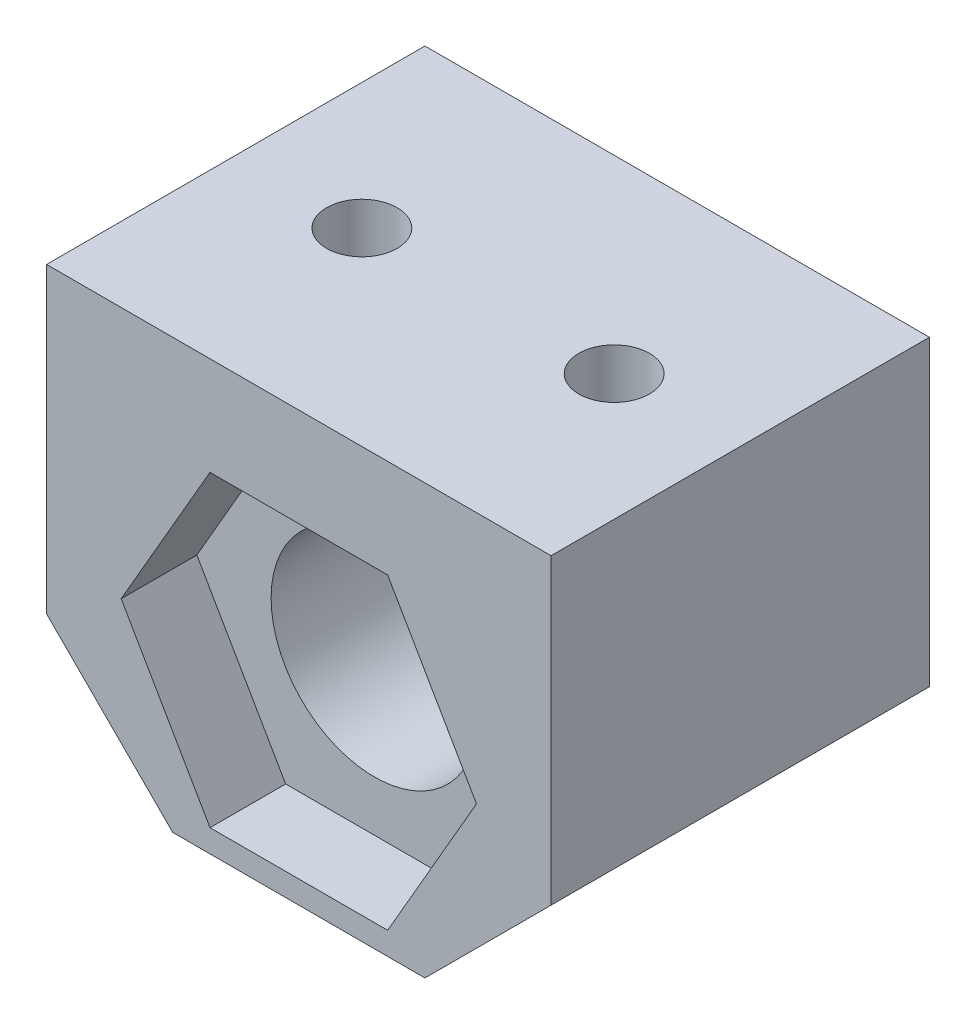
ISO-10303-21;
HEADER;
FILE_DESCRIPTION(('STEP AP214'),'2;1');
FILE_NAME('part.step','',(''),(''),'','','');
FILE_SCHEMA(('AUTOMOTIVE_DESIGN { 1 0 10303 214 1 1 1 1 }'));
ENDSEC;
DATA;
#1=APPLICATION_CONTEXT('core data for automotive mechanical design processes');
#2=APPLICATION_PROTOCOL_DEFINITION('international standard','automotive_design',2000,#1);
#3=PRODUCT_CONTEXT('',#1,'mechanical');
#4=PRODUCT('Part','Part','',(#3));
#5=PRODUCT_RELATED_PRODUCT_CATEGORY('part','',(#4));
#6=PRODUCT_DEFINITION_FORMATION('','',#4);
#7=PRODUCT_DEFINITION_CONTEXT('part definition',#1,'design');
#8=PRODUCT_DEFINITION('design','',#6,#7);
#9=PRODUCT_DEFINITION_SHAPE('','',#8);
#10=(LENGTH_UNIT() NAMED_UNIT(*) SI_UNIT(.MILLI.,.METRE.));
#11=(NAMED_UNIT(*) PLANE_ANGLE_UNIT() SI_UNIT($,.RADIAN.));
#12=(NAMED_UNIT(*) SI_UNIT($,.STERADIAN.) SOLID_ANGLE_UNIT());
#13=UNCERTAINTY_MEASURE_WITH_UNIT(LENGTH_MEASURE(1.E-05),#10,'distance_accuracy_value','');
#14=(GEOMETRIC_REPRESENTATION_CONTEXT(3) GLOBAL_UNCERTAINTY_ASSIGNED_CONTEXT((#13)) GLOBAL_UNIT_ASSIGNED_CONTEXT((#10,
#11,#12)) REPRESENTATION_CONTEXT('',''));
#15=CARTESIAN_POINT('',(0.,0.,0.));
#16=DIRECTION('',(0.,0.,1.));
#17=DIRECTION('',(1.,0.,0.));
#18=AXIS2_PLACEMENT_3D('',#15,#16,#17);
#19=CARTESIAN_POINT('',(0.,0.,7.5));
#20=DIRECTION('',(0.,0.,-1.));
#21=DIRECTION('',(-1.,0.,0.));
#22=AXIS2_PLACEMENT_3D('',#19,#20,#21);
#23=CYLINDRICAL_SURFACE('',#22,4.1);
#24=CARTESIAN_POINT('',(-4.1,0.,-1.07238052947636));
#25=CARTESIAN_POINT('',(-4.10000027994469,0.0421810239568593,-1.0723776114445));
#26=CARTESIAN_POINT('',(-4.09934889561374,0.0843573783202042,-1.07183454365595));
#27=CARTESIAN_POINT('',(-4.09674713424196,0.168644339875269,-1.06964402668439));
#28=CARTESIAN_POINT('',(-4.094796660277,0.210754941926262,-1.06799649509809));
#29=CARTESIAN_POINT('',(-4.08699145378658,0.337085053124134,-1.0613511477874));
#30=CARTESIAN_POINT('',(-4.07918296187757,0.421110692003975,-1.05465036265499));
#31=CARTESIAN_POINT('',(-4.05837510689717,0.588913849612095,-1.03611746021449));
#32=CARTESIAN_POINT('',(-4.04531866623699,0.672678083457172,-1.02422879264474));
#33=CARTESIAN_POINT('',(-4.01430266170025,0.838117759569875,-0.99441694251457));
#34=CARTESIAN_POINT('',(-3.99634943044706,0.91979575162485,-0.97650154689933));
#35=CARTESIAN_POINT('',(-3.9559422841999,1.08046838289653,-0.933181890176492));
#36=CARTESIAN_POINT('',(-3.93346780981669,1.1594487630229,-0.907743160435453));
#37=CARTESIAN_POINT('',(-3.88505524036034,1.31253374565269,-0.847579685062793));
#38=CARTESIAN_POINT('',(-3.85912726546158,1.38665168426822,-0.812881785296205));
#39=CARTESIAN_POINT('',(-3.81146012294276,1.51203050842669,-0.740809213218041));
#40=CARTESIAN_POINT('',(-3.79006231047995,1.56472180930182,-0.70572260416476));
#41=CARTESIAN_POINT('',(-3.74761761846394,1.66380437990746,-0.627311484942095));
#42=CARTESIAN_POINT('',(-3.72657020866454,1.71020610850584,-0.584000945589049));
#43=CARTESIAN_POINT('',(-3.69278495857451,1.78169083308872,-0.502510578964682));
#44=CARTESIAN_POINT('',(-3.67942532442955,1.80902786930238,-0.466575728157518));
#45=CARTESIAN_POINT('',(-3.65492006860638,1.85803875951314,-0.39032889365615));
#46=CARTESIAN_POINT('',(-3.64377182405528,1.87971933224179,-0.350022184191735));
#47=CARTESIAN_POINT('',(-3.62618987338961,1.91338827171731,-0.272017660710073));
#48=CARTESIAN_POINT('',(-3.61929857493094,1.9263455619182,-0.234844143999933));
#49=CARTESIAN_POINT('',(-3.6084751591319,1.94654571692975,-0.158553281727145));
#50=CARTESIAN_POINT('',(-3.60454147419106,1.95379160900613,-0.11943697762206));
#51=CARTESIAN_POINT('',(-3.60001426517025,1.96212164443351,-0.0402232740590481));
#52=CARTESIAN_POINT('',(-3.59943162778152,1.96318570471672,-0.000123101449398373));
#53=CARTESIAN_POINT('',(-3.60169794362566,1.95902450073471,0.0796487198729235));
#54=CARTESIAN_POINT('',(-3.60454707973691,1.95379890129509,0.119320345634767));
#55=CARTESIAN_POINT('',(-3.61315680554743,1.93782687293964,0.195055186051872));
#56=CARTESIAN_POINT('',(-3.61876241986906,1.92737385995454,0.231199366318331));
#57=CARTESIAN_POINT('',(-3.63233044545355,1.90167984281194,0.301256797758232));
#58=CARTESIAN_POINT('',(-3.64029369148806,1.88643714264228,0.335169253533117));
#59=CARTESIAN_POINT('',(-3.66143395987402,1.84516109026009,0.412824311459879));
#60=CARTESIAN_POINT('',(-3.67543847142005,1.81723213465153,0.455334416973406));
#61=CARTESIAN_POINT('',(-3.70545929970594,1.755210743545,0.534768381018135));
#62=CARTESIAN_POINT('',(-3.72147950343995,1.72110634217074,0.571681134090025));
#63=CARTESIAN_POINT('',(-3.76184528504966,1.63152962045985,0.655777098933976));
#64=CARTESIAN_POINT('',(-3.78664326558028,1.57342491251122,0.699920633101305));
#65=CARTESIAN_POINT('',(-3.83537996257004,1.45060584568595,0.778330528856444));
#66=CARTESIAN_POINT('',(-3.85931670571258,1.38587747047205,0.812575333036061));
#67=CARTESIAN_POINT('',(-3.90035837539208,1.26508978502902,0.867008733321448));
#68=CARTESIAN_POINT('',(-3.91788483643796,1.20980444553378,0.888636262826245));
#69=CARTESIAN_POINT('',(-3.95093236308628,1.09708000784028,0.927419868666702));
#70=CARTESIAN_POINT('',(-3.96645214793702,1.03963956403207,0.944573096335318));
#71=CARTESIAN_POINT('',(-3.99519123099207,0.923071503656668,0.975088926606508));
#72=CARTESIAN_POINT('',(-4.00840542604022,0.863940473335938,0.988443160722875));
#73=CARTESIAN_POINT('',(-4.0322943152765,0.744520800742044,1.01184244300948));
#74=CARTESIAN_POINT('',(-4.042968697595,0.684232017286892,1.02188708484524));
#75=CARTESIAN_POINT('',(-4.06022100540939,0.57211351388721,1.03775239848507));
#76=CARTESIAN_POINT('',(-4.06717560424631,0.52039836682705,1.04398391482928));
#77=CARTESIAN_POINT('',(-4.07911987092944,0.416548820132829,1.05453449944899));
#78=CARTESIAN_POINT('',(-4.08410956331334,0.364414425742611,1.05885359160684));
#79=CARTESIAN_POINT('',(-4.09205952806294,0.260292847079017,1.06567948544875));
#80=CARTESIAN_POINT('',(-4.09503560216838,0.208307781644246,1.06820040685377));
#81=CARTESIAN_POINT('',(-4.09900672922874,0.10421464968066,1.07154651828353));
#82=CARTESIAN_POINT('',(-4.10000206225541,0.0521066015846196,1.072371948047));
#83=CARTESIAN_POINT('',(-4.1,0.,1.07238052947645));
#84=B_SPLINE_CURVE_WITH_KNOTS('',3,(#24,#25,#26,#27,#28,#29,#30,#31,#32,#33,#34,#35,#36,#37,#38,
#39,#40,#41,#42,#43,#44,#45,#46,#47,#48,#49,#50,#51,#52,#53,#54,#55,#56,#57,#58,#59,#60,#61,#62,
#63,#64,#65,#66,#67,#68,#69,#70,#71,#72,#73,#74,#75,#76,#77,#78,#79,#80,#81,#82,#83),
.UNSPECIFIED.,.F.,.F.,(4,2,2,2,2,2,2,2,2,2,2,2,2,2,2,2,2,2,2,2,2,2,2,2,2,2,2,2,2,4),(0.,
0.126524990315177,0.253059421625783,0.506703100488168,0.763183509340239,1.0193337927073,
1.27667632178803,1.53328067443359,1.73314959492909,1.93268196748954,2.0734556079831,
2.21406126874377,2.33344713397825,2.45276967737524,2.57247965100362,2.69219600422903,
2.80584120448671,2.91952669156226,3.07691418522235,3.2346099698281,3.46453431520818,
3.69495567991198,3.8804012323723,4.06596456639904,4.25193355202518,4.43792536145281,
4.59550686544868,4.75308640151053,4.90941453684089,5.0657205661994),.UNSPECIFIED.);
#85=CARTESIAN_POINT('',(-4.1,0.,-1.07238052947636));
#86=VERTEX_POINT('',#85);
#87=CARTESIAN_POINT('',(-4.1,0.,1.07238052947636));
#88=VERTEX_POINT('',#87);
#89=EDGE_CURVE('E139',#86,#88,#84,.T.);
#90=ORIENTED_EDGE('',*,*,#89,.F.);
#91=DIRECTION('',(0.,0.,-1.));
#92=VECTOR('',#91,1.);
#93=CARTESIAN_POINT('',(-4.1,0.,7.5));
#94=LINE('',#93,#92);
#95=EDGE_CURVE('E11',#86,#88,#94,.F.);
#96=ORIENTED_EDGE('',*,*,#95,.T.);
#97=EDGE_LOOP('',(#90,#96));
#98=FACE_BOUND('',#97,.T.);
#99=CARTESIAN_POINT('',(4.1,0.,1.07238052947636));
#100=CARTESIAN_POINT('',(4.10000027994469,0.0421810239568593,1.0723776114445));
#101=CARTESIAN_POINT('',(4.09934889561374,0.0843573783202042,1.07183454365595));
#102=CARTESIAN_POINT('',(4.09674713424196,0.168644339875269,1.06964402668439));
#103=CARTESIAN_POINT('',(4.094796660277,0.210754941926262,1.06799649509809));
#104=CARTESIAN_POINT('',(4.08699145378658,0.337085053124134,1.0613511477874));
#105=CARTESIAN_POINT('',(4.07918296187757,0.421110692003975,1.05465036265499));
#106=CARTESIAN_POINT('',(4.05837510689717,0.588913849612095,1.03611746021449));
#107=CARTESIAN_POINT('',(4.04531866623699,0.672678083457172,1.02422879264474));
#108=CARTESIAN_POINT('',(4.01430266170025,0.838117759569875,0.99441694251457));
#109=CARTESIAN_POINT('',(3.99634943044706,0.91979575162485,0.97650154689933));
#110=CARTESIAN_POINT('',(3.9559422841999,1.08046838289653,0.933181890176492));
#111=CARTESIAN_POINT('',(3.93346780981669,1.1594487630229,0.907743160435453));
#112=CARTESIAN_POINT('',(3.88505524036034,1.31253374565269,0.847579685062793));
#113=CARTESIAN_POINT('',(3.85912726546158,1.38665168426822,0.812881785296205));
#114=CARTESIAN_POINT('',(3.81146012294276,1.51203050842669,0.740809213218041));
#115=CARTESIAN_POINT('',(3.79006231047995,1.56472180930182,0.70572260416476));
#116=CARTESIAN_POINT('',(3.74761761846394,1.66380437990746,0.627311484942095));
#117=CARTESIAN_POINT('',(3.72657020866454,1.71020610850584,0.584000945589049));
#118=CARTESIAN_POINT('',(3.69278495857451,1.78169083308872,0.502510578964682));
#119=CARTESIAN_POINT('',(3.67942532442955,1.80902786930238,0.466575728157518));
#120=CARTESIAN_POINT('',(3.65492006860638,1.85803875951314,0.39032889365615));
#121=CARTESIAN_POINT('',(3.64377182405528,1.87971933224179,0.350022184191735));
#122=CARTESIAN_POINT('',(3.62618987338961,1.91338827171731,0.272017660710073));
#123=CARTESIAN_POINT('',(3.61929857493094,1.9263455619182,0.234844143999933));
#124=CARTESIAN_POINT('',(3.6084751591319,1.94654571692975,0.158553281727145));
#125=CARTESIAN_POINT('',(3.60454147419106,1.95379160900613,0.11943697762206));
#126=CARTESIAN_POINT('',(3.60001426517025,1.96212164443351,0.0402232740590481));
#127=CARTESIAN_POINT('',(3.59943162778152,1.96318570471672,0.000123101449398373));
#128=CARTESIAN_POINT('',(3.60169794362566,1.95902450073471,-0.0796487198729235));
#129=CARTESIAN_POINT('',(3.60454707973691,1.95379890129509,-0.119320345634767));
#130=CARTESIAN_POINT('',(3.61315680554743,1.93782687293964,-0.195055186051872));
#131=CARTESIAN_POINT('',(3.61876241986906,1.92737385995454,-0.231199366318331));
#132=CARTESIAN_POINT('',(3.63233044545355,1.90167984281194,-0.301256797758232));
#133=CARTESIAN_POINT('',(3.64029369148806,1.88643714264228,-0.335169253533117));
#134=CARTESIAN_POINT('',(3.66143395987402,1.84516109026009,-0.412824311459879));
#135=CARTESIAN_POINT('',(3.67543847142005,1.81723213465153,-0.455334416973406));
#136=CARTESIAN_POINT('',(3.70545929970594,1.755210743545,-0.534768381018135));
#137=CARTESIAN_POINT('',(3.72147950343995,1.72110634217074,-0.571681134090025));
#138=CARTESIAN_POINT('',(3.76184528504966,1.63152962045985,-0.655777098933976));
#139=CARTESIAN_POINT('',(3.78664326558028,1.57342491251122,-0.699920633101305));
#140=CARTESIAN_POINT('',(3.83537996257004,1.45060584568595,-0.778330528856444));
#141=CARTESIAN_POINT('',(3.85931670571258,1.38587747047205,-0.812575333036061));
#142=CARTESIAN_POINT('',(3.90035837539208,1.26508978502902,-0.867008733321448));
#143=CARTESIAN_POINT('',(3.91788483643796,1.20980444553378,-0.888636262826245));
#144=CARTESIAN_POINT('',(3.95093236308628,1.09708000784028,-0.927419868666702));
#145=CARTESIAN_POINT('',(3.96645214793702,1.03963956403207,-0.944573096335318));
#146=CARTESIAN_POINT('',(3.99519123099207,0.923071503656668,-0.975088926606508));
#147=CARTESIAN_POINT('',(4.00840542604022,0.863940473335938,-0.988443160722875));
#148=CARTESIAN_POINT('',(4.0322943152765,0.744520800742044,-1.01184244300948));
#149=CARTESIAN_POINT('',(4.042968697595,0.684232017286892,-1.02188708484524));
#150=CARTESIAN_POINT('',(4.06022100540939,0.57211351388721,-1.03775239848507));
#151=CARTESIAN_POINT('',(4.06717560424631,0.52039836682705,-1.04398391482928));
#152=CARTESIAN_POINT('',(4.07911987092944,0.416548820132829,-1.05453449944899));
#153=CARTESIAN_POINT('',(4.08410956331334,0.364414425742611,-1.05885359160684));
#154=CARTESIAN_POINT('',(4.09205952806294,0.260292847079017,-1.06567948544875));
#155=CARTESIAN_POINT('',(4.09503560216838,0.208307781644246,-1.06820040685377));
#156=CARTESIAN_POINT('',(4.09900672922874,0.10421464968066,-1.07154651828353));
#157=CARTESIAN_POINT('',(4.10000206225541,0.0521066015846196,-1.072371948047));
#158=CARTESIAN_POINT('',(4.1,0.,-1.07238052947645));
#159=B_SPLINE_CURVE_WITH_KNOTS('',3,(#99,#100,#101,#102,#103,#104,#105,#106,#107,#108,#109,#110,
#111,#112,#113,#114,#115,#116,#117,#118,#119,#120,#121,#122,#123,#124,#125,#126,#127,#128,#129,
#130,#131,#132,#133,#134,#135,#136,#137,#138,#139,#140,#141,#142,#143,#144,#145,#146,#147,#148,
#149,#150,#151,#152,#153,#154,#155,#156,#157,#158),.UNSPECIFIED.,.F.,.F.,(4,2,2,2,2,2,2,2,2,2,2,
2,2,2,2,2,2,2,2,2,2,2,2,2,2,2,2,2,2,4),(0.,0.126524990315177,0.253059421625783,
0.506703100488168,0.763183509340239,1.0193337927073,1.27667632178803,1.53328067443359,
1.73314959492909,1.93268196748954,2.0734556079831,2.21406126874377,2.33344713397825,
2.45276967737524,2.57247965100362,2.69219600422903,2.80584120448671,2.91952669156226,
3.07691418522235,3.2346099698281,3.46453431520818,3.69495567991198,3.8804012323723,
4.06596456639904,4.25193355202518,4.43792536145281,4.59550686544868,4.75308640151053,
4.90941453684089,5.0657205661994),.UNSPECIFIED.);
#160=CARTESIAN_POINT('',(4.1,0.,1.07238052947636));
#161=VERTEX_POINT('',#160);
#162=CARTESIAN_POINT('',(4.1,0.,-1.07238052947636));
#163=VERTEX_POINT('',#162);
#164=EDGE_CURVE('E172',#161,#163,#159,.T.);
#165=ORIENTED_EDGE('',*,*,#164,.F.);
#166=DIRECTION('',(0.,0.,-1.));
#167=VECTOR('',#166,1.);
#168=CARTESIAN_POINT('',(4.1,0.,7.5));
#169=LINE('',#168,#167);
#170=EDGE_CURVE('E43',#161,#163,#169,.T.);
#171=ORIENTED_EDGE('',*,*,#170,.T.);
#172=EDGE_LOOP('',(#165,#171));
#173=FACE_BOUND('',#172,.T.);
#174=CARTESIAN_POINT('',(0.,0.,-7.5));
#175=DIRECTION('',(0.,0.,1.));
#176=DIRECTION('',(1.,0.,0.));
#177=AXIS2_PLACEMENT_3D('',#174,#175,#176);
#178=CIRCLE('',#177,4.1);
#179=CARTESIAN_POINT('',(4.1,0.,-7.5));
#180=VERTEX_POINT('',#179);
#181=EDGE_CURVE('E226',#180,#180,#178,.T.);
#182=ORIENTED_EDGE('',*,*,#181,.F.);
#183=EDGE_LOOP('',(#182));
#184=FACE_BOUND('',#183,.T.);
#185=CARTESIAN_POINT('',(0.,0.,4.5));
#186=DIRECTION('',(0.,0.,1.));
#187=DIRECTION('',(1.,0.,0.));
#188=AXIS2_PLACEMENT_3D('',#185,#186,#187);
#189=CIRCLE('',#188,4.1);
#190=CARTESIAN_POINT('',(4.1,0.,4.5));
#191=VERTEX_POINT('',#190);
#192=EDGE_CURVE('E215',#191,#191,#189,.T.);
#193=ORIENTED_EDGE('',*,*,#192,.T.);
#194=EDGE_LOOP('',(#193));
#195=FACE_BOUND('',#194,.T.);
#196=ADVANCED_FACE('F35',(#98,#173,#184,#195),#23,.F.);
#197=CARTESIAN_POINT('',(0.,0.,7.5));
#198=DIRECTION('',(0.,0.,-1.));
#199=DIRECTION('',(-1.,0.,0.));
#200=AXIS2_PLACEMENT_3D('',#197,#198,#199);
#201=PLANE('',#200);
#202=DIRECTION('',(-0.5,0.866025403784438,0.));
#203=VECTOR('',#202,1.);
#204=CARTESIAN_POINT('',(7.04367328411344,0.,7.5));
#205=LINE('',#204,#203);
#206=CARTESIAN_POINT('',(7.04367328411344,0.,7.5));
#207=VERTEX_POINT('',#206);
#208=CARTESIAN_POINT('',(3.52183664205672,6.1,7.5));
#209=VERTEX_POINT('',#208);
#210=EDGE_CURVE('E199',#207,#209,#205,.T.);
#211=ORIENTED_EDGE('',*,*,#210,.F.);
#212=DIRECTION('',(0.5,0.866025403784439,0.));
#213=VECTOR('',#212,1.);
#214=CARTESIAN_POINT('',(3.52183664205672,-6.1,7.5));
#215=LINE('',#214,#213);
#216=CARTESIAN_POINT('',(3.52183664205672,-6.1,7.5));
#217=VERTEX_POINT('',#216);
#218=EDGE_CURVE('E177',#217,#207,#215,.T.);
#219=ORIENTED_EDGE('',*,*,#218,.F.);
#220=DIRECTION('',(1.,0.,0.));
#221=VECTOR('',#220,1.);
#222=CARTESIAN_POINT('',(-3.52183664205671,-6.1,7.5));
#223=LINE('',#222,#221);
#224=CARTESIAN_POINT('',(-3.52183664205671,-6.1,7.5));
#225=VERTEX_POINT('',#224);
#226=EDGE_CURVE('E182',#225,#217,#223,.T.);
#227=ORIENTED_EDGE('',*,*,#226,.F.);
#228=DIRECTION('',(0.5,-0.866025403784438,0.));
#229=VECTOR('',#228,1.);
#230=CARTESIAN_POINT('',(-7.04367328411343,0.,7.5));
#231=LINE('',#230,#229);
#232=CARTESIAN_POINT('',(-7.04367328411343,0.,7.5));
#233=VERTEX_POINT('',#232);
#234=EDGE_CURVE('E208',#233,#225,#231,.T.);
#235=ORIENTED_EDGE('',*,*,#234,.F.);
#236=DIRECTION('',(-0.5,-0.866025403784439,0.));
#237=VECTOR('',#236,1.);
#238=CARTESIAN_POINT('',(-3.52183664205672,6.1,7.5));
#239=LINE('',#238,#237);
#240=CARTESIAN_POINT('',(-3.52183664205672,6.1,7.5));
#241=VERTEX_POINT('',#240);
#242=EDGE_CURVE('E205',#241,#233,#239,.T.);
#243=ORIENTED_EDGE('',*,*,#242,.F.);
#244=DIRECTION('',(-1.,0.,0.));
#245=VECTOR('',#244,1.);
#246=CARTESIAN_POINT('',(3.52183664205672,6.1,7.5));
#247=LINE('',#246,#245);
#248=EDGE_CURVE('E202',#209,#241,#247,.T.);
#249=ORIENTED_EDGE('',*,*,#248,.F.);
#250=EDGE_LOOP('',(#211,#219,#227,#235,#243,#249));
#251=FACE_BOUND('',#250,.T.);
#252=DIRECTION('',(0.,-1.,0.));
#253=VECTOR('',#252,1.);
#254=CARTESIAN_POINT('',(-10.,-2.,7.5));
#255=LINE('',#254,#253);
#256=CARTESIAN_POINT('',(-10.,10.,7.5));
#257=VERTEX_POINT('',#256);
#258=CARTESIAN_POINT('',(-10.,-2.,7.5));
#259=VERTEX_POINT('',#258);
#260=EDGE_CURVE('E230',#257,#259,#255,.T.);
#261=ORIENTED_EDGE('',*,*,#260,.T.);
#262=DIRECTION('',(0.707106781186548,-0.707106781186547,0.));
#263=VECTOR('',#262,1.);
#264=CARTESIAN_POINT('',(-5.,-7.,7.5));
#265=LINE('',#264,#263);
#266=CARTESIAN_POINT('',(-5.,-7.,7.5));
#267=VERTEX_POINT('',#266);
#268=EDGE_CURVE('E233',#259,#267,#265,.T.);
#269=ORIENTED_EDGE('',*,*,#268,.T.);
#270=DIRECTION('',(1.,0.,0.));
#271=VECTOR('',#270,1.);
#272=CARTESIAN_POINT('',(5.,-7.,7.5));
#273=LINE('',#272,#271);
#274=CARTESIAN_POINT('',(5.,-7.,7.5));
#275=VERTEX_POINT('',#274);
#276=EDGE_CURVE('E236',#267,#275,#273,.T.);
#277=ORIENTED_EDGE('',*,*,#276,.T.);
#278=DIRECTION('',(0.707106781186548,0.707106781186547,0.));
#279=VECTOR('',#278,1.);
#280=CARTESIAN_POINT('',(10.,-2.,7.5));
#281=LINE('',#280,#279);
#282=CARTESIAN_POINT('',(10.,-2.,7.5));
#283=VERTEX_POINT('',#282);
#284=EDGE_CURVE('E238',#275,#283,#281,.T.);
#285=ORIENTED_EDGE('',*,*,#284,.T.);
#286=DIRECTION('',(0.,1.,0.));
#287=VECTOR('',#286,1.);
#288=CARTESIAN_POINT('',(10.,10.,7.5));
#289=LINE('',#288,#287);
#290=CARTESIAN_POINT('',(10.,10.,7.5));
#291=VERTEX_POINT('',#290);
#292=EDGE_CURVE('E240',#283,#291,#289,.T.);
#293=ORIENTED_EDGE('',*,*,#292,.T.);
#294=DIRECTION('',(-1.,0.,0.));
#295=VECTOR('',#294,1.);
#296=CARTESIAN_POINT('',(-10.,10.,7.5));
#297=LINE('',#296,#295);
#298=EDGE_CURVE('E242',#291,#257,#297,.T.);
#299=ORIENTED_EDGE('',*,*,#298,.T.);
#300=EDGE_LOOP('',(#261,#269,#277,#285,#293,#299));
#301=FACE_BOUND('',#300,.T.);
#302=ADVANCED_FACE('F306',(#251,#301),#201,.F.);
#303=CARTESIAN_POINT('',(0.,0.,-7.5));
#304=DIRECTION('',(0.,0.,-1.));
#305=DIRECTION('',(-1.,0.,0.));
#306=AXIS2_PLACEMENT_3D('',#303,#304,#305);
#307=PLANE('',#306);
#308=DIRECTION('',(0.,-1.,0.));
#309=VECTOR('',#308,1.);
#310=CARTESIAN_POINT('',(-10.,-2.,-7.5));
#311=LINE('',#310,#309);
#312=CARTESIAN_POINT('',(-10.,10.,-7.5));
#313=VERTEX_POINT('',#312);
#314=CARTESIAN_POINT('',(-10.,-2.,-7.5));
#315=VERTEX_POINT('',#314);
#316=EDGE_CURVE('E229',#313,#315,#311,.T.);
#317=ORIENTED_EDGE('',*,*,#316,.F.);
#318=DIRECTION('',(-1.,0.,0.));
#319=VECTOR('',#318,1.);
#320=CARTESIAN_POINT('',(-10.,10.,-7.5));
#321=LINE('',#320,#319);
#322=CARTESIAN_POINT('',(10.,10.,-7.5));
#323=VERTEX_POINT('',#322);
#324=EDGE_CURVE('E234',#323,#313,#321,.T.);
#325=ORIENTED_EDGE('',*,*,#324,.F.);
#326=DIRECTION('',(0.,1.,0.));
#327=VECTOR('',#326,1.);
#328=CARTESIAN_POINT('',(10.,10.,-7.5));
#329=LINE('',#328,#327);
#330=CARTESIAN_POINT('',(10.,-2.,-7.5));
#331=VERTEX_POINT('',#330);
#332=EDGE_CURVE('E253',#331,#323,#329,.T.);
#333=ORIENTED_EDGE('',*,*,#332,.F.);
#334=DIRECTION('',(0.707106781186548,0.707106781186547,0.));
#335=VECTOR('',#334,1.);
#336=CARTESIAN_POINT('',(10.,-2.,-7.5));
#337=LINE('',#336,#335);
#338=CARTESIAN_POINT('',(5.,-7.,-7.5));
#339=VERTEX_POINT('',#338);
#340=EDGE_CURVE('E251',#339,#331,#337,.T.);
#341=ORIENTED_EDGE('',*,*,#340,.F.);
#342=DIRECTION('',(1.,0.,0.));
#343=VECTOR('',#342,1.);
#344=CARTESIAN_POINT('',(5.,-7.,-7.5));
#345=LINE('',#344,#343);
#346=CARTESIAN_POINT('',(-5.,-7.,-7.5));
#347=VERTEX_POINT('',#346);
#348=EDGE_CURVE('E249',#347,#339,#345,.T.);
#349=ORIENTED_EDGE('',*,*,#348,.F.);
#350=DIRECTION('',(0.707106781186548,-0.707106781186547,0.));
#351=VECTOR('',#350,1.);
#352=CARTESIAN_POINT('',(-5.,-7.,-7.5));
#353=LINE('',#352,#351);
#354=EDGE_CURVE('E247',#315,#347,#353,.T.);
#355=ORIENTED_EDGE('',*,*,#354,.F.);
#356=EDGE_LOOP('',(#317,#325,#333,#341,#349,#355));
#357=FACE_BOUND('',#356,.T.);
#358=ORIENTED_EDGE('',*,*,#181,.T.);
#359=EDGE_LOOP('',(#358));
#360=FACE_BOUND('',#359,.T.);
#361=ADVANCED_FACE('F297',(#357,#360),#307,.T.);
#362=CARTESIAN_POINT('',(-10.,-2.,7.5));
#363=DIRECTION('',(1.,0.,0.));
#364=DIRECTION('',(0.,0.,-1.));
#365=AXIS2_PLACEMENT_3D('',#362,#363,#364);
#366=PLANE('',#365);
#367=ORIENTED_EDGE('',*,*,#316,.T.);
#368=DIRECTION('',(0.,0.,-1.));
#369=VECTOR('',#368,1.);
#370=CARTESIAN_POINT('',(-10.,-2.,7.5));
#371=LINE('',#370,#369);
#372=EDGE_CURVE('E270',#259,#315,#371,.T.);
#373=ORIENTED_EDGE('',*,*,#372,.F.);
#374=ORIENTED_EDGE('',*,*,#260,.F.);
#375=DIRECTION('',(0.,0.,-1.));
#376=VECTOR('',#375,1.);
#377=CARTESIAN_POINT('',(-10.,10.,7.5));
#378=LINE('',#377,#376);
#379=EDGE_CURVE('E244',#257,#313,#378,.T.);
#380=ORIENTED_EDGE('',*,*,#379,.T.);
#381=EDGE_LOOP('',(#367,#373,#374,#380));
#382=FACE_BOUND('',#381,.T.);
#383=ADVANCED_FACE('F37',(#382),#366,.F.);
#384=CARTESIAN_POINT('',(-5.,-7.,7.5));
#385=DIRECTION('',(0.707106781186547,0.707106781186548,0.));
#386=DIRECTION('',(-0.707106781186548,0.707106781186547,0.));
#387=AXIS2_PLACEMENT_3D('',#384,#385,#386);
#388=PLANE('',#387);
#389=ORIENTED_EDGE('',*,*,#354,.T.);
#390=DIRECTION('',(0.,0.,-1.));
#391=VECTOR('',#390,1.);
#392=CARTESIAN_POINT('',(-5.,-7.,7.5));
#393=LINE('',#392,#391);
#394=EDGE_CURVE('E267',#267,#347,#393,.T.);
#395=ORIENTED_EDGE('',*,*,#394,.F.);
#396=ORIENTED_EDGE('',*,*,#268,.F.);
#397=ORIENTED_EDGE('',*,*,#372,.T.);
#398=EDGE_LOOP('',(#389,#395,#396,#397));
#399=FACE_BOUND('',#398,.T.);
#400=ADVANCED_FACE('F303',(#399),#388,.F.);
#401=CARTESIAN_POINT('',(5.,-7.,7.5));
#402=DIRECTION('',(0.,1.,0.));
#403=DIRECTION('',(0.,0.,1.));
#404=AXIS2_PLACEMENT_3D('',#401,#402,#403);
#405=PLANE('',#404);
#406=ORIENTED_EDGE('',*,*,#348,.T.);
#407=DIRECTION('',(0.,0.,-1.));
#408=VECTOR('',#407,1.);
#409=CARTESIAN_POINT('',(5.,-7.,7.5));
#410=LINE('',#409,#408);
#411=EDGE_CURVE('E264',#275,#339,#410,.T.);
#412=ORIENTED_EDGE('',*,*,#411,.F.);
#413=ORIENTED_EDGE('',*,*,#276,.F.);
#414=ORIENTED_EDGE('',*,*,#394,.T.);
#415=EDGE_LOOP('',(#406,#412,#413,#414));
#416=FACE_BOUND('',#415,.T.);
#417=ADVANCED_FACE('F315',(#416),#405,.F.);
#418=CARTESIAN_POINT('',(10.,-2.,7.5));
#419=DIRECTION('',(-0.707106781186547,0.707106781186548,0.));
#420=DIRECTION('',(-0.707106781186548,-0.707106781186547,0.));
#421=AXIS2_PLACEMENT_3D('',#418,#419,#420);
#422=PLANE('',#421);
#423=ORIENTED_EDGE('',*,*,#340,.T.);
#424=DIRECTION('',(0.,0.,-1.));
#425=VECTOR('',#424,1.);
#426=CARTESIAN_POINT('',(10.,-2.,7.5));
#427=LINE('',#426,#425);
#428=EDGE_CURVE('E261',#283,#331,#427,.T.);
#429=ORIENTED_EDGE('',*,*,#428,.F.);
#430=ORIENTED_EDGE('',*,*,#284,.F.);
#431=ORIENTED_EDGE('',*,*,#411,.T.);
#432=EDGE_LOOP('',(#423,#429,#430,#431));
#433=FACE_BOUND('',#432,.T.);
#434=ADVANCED_FACE('F312',(#433),#422,.F.);
#435=CARTESIAN_POINT('',(10.,10.,7.5));
#436=DIRECTION('',(-1.,0.,0.));
#437=DIRECTION('',(0.,0.,1.));
#438=AXIS2_PLACEMENT_3D('',#435,#436,#437);
#439=PLANE('',#438);
#440=ORIENTED_EDGE('',*,*,#332,.T.);
#441=DIRECTION('',(0.,0.,-1.));
#442=VECTOR('',#441,1.);
#443=CARTESIAN_POINT('',(10.,10.,7.5));
#444=LINE('',#443,#442);
#445=EDGE_CURVE('E258',#291,#323,#444,.T.);
#446=ORIENTED_EDGE('',*,*,#445,.F.);
#447=ORIENTED_EDGE('',*,*,#292,.F.);
#448=ORIENTED_EDGE('',*,*,#428,.T.);
#449=EDGE_LOOP('',(#440,#446,#447,#448));
#450=FACE_BOUND('',#449,.T.);
#451=ADVANCED_FACE('F284',(#450),#439,.F.);
#452=CARTESIAN_POINT('',(-10.,10.,7.5));
#453=DIRECTION('',(0.,-1.,0.));
#454=DIRECTION('',(0.,0.,-1.));
#455=AXIS2_PLACEMENT_3D('',#452,#453,#454);
#456=PLANE('',#455);
#457=CARTESIAN_POINT('',(-5.,10.,0.));
#458=DIRECTION('',(0.,1.,0.));
#459=DIRECTION('',(0.,0.,1.));
#460=AXIS2_PLACEMENT_3D('',#457,#458,#459);
#461=CIRCLE('',#460,1.4);
#462=CARTESIAN_POINT('',(-5.,10.,1.4));
#463=VERTEX_POINT('',#462);
#464=EDGE_CURVE('E140',#463,#463,#461,.T.);
#465=ORIENTED_EDGE('',*,*,#464,.F.);
#466=EDGE_LOOP('',(#465));
#467=FACE_BOUND('',#466,.T.);
#468=CARTESIAN_POINT('',(5.,10.,0.));
#469=DIRECTION('',(0.,1.,0.));
#470=DIRECTION('',(0.,0.,1.));
#471=AXIS2_PLACEMENT_3D('',#468,#469,#470);
#472=CIRCLE('',#471,1.4);
#473=CARTESIAN_POINT('',(5.,10.,1.4));
#474=VERTEX_POINT('',#473);
#475=EDGE_CURVE('E143',#474,#474,#472,.T.);
#476=ORIENTED_EDGE('',*,*,#475,.F.);
#477=EDGE_LOOP('',(#476));
#478=FACE_BOUND('',#477,.T.);
#479=ORIENTED_EDGE('',*,*,#324,.T.);
#480=ORIENTED_EDGE('',*,*,#379,.F.);
#481=ORIENTED_EDGE('',*,*,#298,.F.);
#482=ORIENTED_EDGE('',*,*,#445,.T.);
#483=EDGE_LOOP('',(#479,#480,#481,#482));
#484=FACE_BOUND('',#483,.T.);
#485=ADVANCED_FACE('F280',(#467,#478,#484),#456,.F.);
#486=CARTESIAN_POINT('',(3.52183664205672,-6.1,4.5));
#487=DIRECTION('',(0.866025403784439,-0.5,0.));
#488=DIRECTION('',(0.5,0.866025403784439,0.));
#489=AXIS2_PLACEMENT_3D('',#486,#487,#488);
#490=PLANE('',#489);
#491=ORIENTED_EDGE('',*,*,#218,.T.);
#492=DIRECTION('',(0.,0.,1.));
#493=VECTOR('',#492,1.);
#494=CARTESIAN_POINT('',(7.04367328411344,0.,4.5));
#495=LINE('',#494,#493);
#496=CARTESIAN_POINT('',(7.04367328411344,0.,4.5));
#497=VERTEX_POINT('',#496);
#498=EDGE_CURVE('E197',#497,#207,#495,.T.);
#499=ORIENTED_EDGE('',*,*,#498,.F.);
#500=DIRECTION('',(0.5,0.866025403784439,0.));
#501=VECTOR('',#500,1.);
#502=CARTESIAN_POINT('',(3.52183664205672,-6.1,4.5));
#503=LINE('',#502,#501);
#504=CARTESIAN_POINT('',(3.52183664205672,-6.1,4.5));
#505=VERTEX_POINT('',#504);
#506=EDGE_CURVE('E178',#505,#497,#503,.T.);
#507=ORIENTED_EDGE('',*,*,#506,.F.);
#508=DIRECTION('',(0.,0.,1.));
#509=VECTOR('',#508,1.);
#510=CARTESIAN_POINT('',(3.52183664205672,-6.1,4.5));
#511=LINE('',#510,#509);
#512=EDGE_CURVE('E213',#505,#217,#511,.T.);
#513=ORIENTED_EDGE('',*,*,#512,.T.);
#514=EDGE_LOOP('',(#491,#499,#507,#513));
#515=FACE_BOUND('',#514,.T.);
#516=ADVANCED_FACE('F283',(#515),#490,.F.);
#517=CARTESIAN_POINT('',(-3.52183664205671,-6.1,4.5));
#518=DIRECTION('',(0.,-1.,0.));
#519=DIRECTION('',(0.,0.,-1.));
#520=AXIS2_PLACEMENT_3D('',#517,#518,#519);
#521=PLANE('',#520);
#522=ORIENTED_EDGE('',*,*,#226,.T.);
#523=ORIENTED_EDGE('',*,*,#512,.F.);
#524=DIRECTION('',(1.,0.,0.));
#525=VECTOR('',#524,1.);
#526=CARTESIAN_POINT('',(-3.52183664205671,-6.1,4.5));
#527=LINE('',#526,#525);
#528=CARTESIAN_POINT('',(-3.52183664205671,-6.1,4.5));
#529=VERTEX_POINT('',#528);
#530=EDGE_CURVE('E194',#529,#505,#527,.T.);
#531=ORIENTED_EDGE('',*,*,#530,.F.);
#532=DIRECTION('',(0.,0.,1.));
#533=VECTOR('',#532,1.);
#534=CARTESIAN_POINT('',(-3.52183664205671,-6.1,4.5));
#535=LINE('',#534,#533);
#536=EDGE_CURVE('E216',#529,#225,#535,.T.);
#537=ORIENTED_EDGE('',*,*,#536,.T.);
#538=EDGE_LOOP('',(#522,#523,#531,#537));
#539=FACE_BOUND('',#538,.T.);
#540=ADVANCED_FACE('F350',(#539),#521,.F.);
#541=CARTESIAN_POINT('',(-7.04367328411343,0.,4.5));
#542=DIRECTION('',(-0.866025403784439,-0.5,0.));
#543=DIRECTION('',(0.5,-0.866025403784439,0.));
#544=AXIS2_PLACEMENT_3D('',#541,#542,#543);
#545=PLANE('',#544);
#546=ORIENTED_EDGE('',*,*,#234,.T.);
#547=ORIENTED_EDGE('',*,*,#536,.F.);
#548=DIRECTION('',(0.5,-0.866025403784438,0.));
#549=VECTOR('',#548,1.);
#550=CARTESIAN_POINT('',(-7.04367328411343,0.,4.5));
#551=LINE('',#550,#549);
#552=CARTESIAN_POINT('',(-7.04367328411343,0.,4.5));
#553=VERTEX_POINT('',#552);
#554=EDGE_CURVE('E191',#553,#529,#551,.T.);
#555=ORIENTED_EDGE('',*,*,#554,.F.);
#556=DIRECTION('',(0.,0.,1.));
#557=VECTOR('',#556,1.);
#558=CARTESIAN_POINT('',(-7.04367328411343,0.,4.5));
#559=LINE('',#558,#557);
#560=EDGE_CURVE('E218',#553,#233,#559,.T.);
#561=ORIENTED_EDGE('',*,*,#560,.T.);
#562=EDGE_LOOP('',(#546,#547,#555,#561));
#563=FACE_BOUND('',#562,.T.);
#564=ADVANCED_FACE('F357',(#563),#545,.F.);
#565=CARTESIAN_POINT('',(-3.52183664205672,6.1,4.5));
#566=DIRECTION('',(-0.866025403784439,0.5,0.));
#567=DIRECTION('',(-0.5,-0.866025403784439,0.));
#568=AXIS2_PLACEMENT_3D('',#565,#566,#567);
#569=PLANE('',#568);
#570=ORIENTED_EDGE('',*,*,#242,.T.);
#571=ORIENTED_EDGE('',*,*,#560,.F.);
#572=DIRECTION('',(-0.5,-0.866025403784439,0.));
#573=VECTOR('',#572,1.);
#574=CARTESIAN_POINT('',(-3.52183664205672,6.1,4.5));
#575=LINE('',#574,#573);
#576=CARTESIAN_POINT('',(-3.52183664205672,6.1,4.5));
#577=VERTEX_POINT('',#576);
#578=EDGE_CURVE('E188',#577,#553,#575,.T.);
#579=ORIENTED_EDGE('',*,*,#578,.F.);
#580=DIRECTION('',(0.,0.,1.));
#581=VECTOR('',#580,1.);
#582=CARTESIAN_POINT('',(-3.52183664205672,6.1,4.5));
#583=LINE('',#582,#581);
#584=EDGE_CURVE('E220',#577,#241,#583,.T.);
#585=ORIENTED_EDGE('',*,*,#584,.T.);
#586=EDGE_LOOP('',(#570,#571,#579,#585));
#587=FACE_BOUND('',#586,.T.);
#588=ADVANCED_FACE('F364',(#587),#569,.F.);
#589=CARTESIAN_POINT('',(3.52183664205672,6.1,4.5));
#590=DIRECTION('',(0.,1.,0.));
#591=DIRECTION('',(-1.,0.,0.));
#592=AXIS2_PLACEMENT_3D('',#589,#590,#591);
#593=PLANE('',#592);
#594=ORIENTED_EDGE('',*,*,#248,.T.);
#595=ORIENTED_EDGE('',*,*,#584,.F.);
#596=DIRECTION('',(-1.,0.,0.));
#597=VECTOR('',#596,1.);
#598=CARTESIAN_POINT('',(3.52183664205672,6.1,4.5));
#599=LINE('',#598,#597);
#600=CARTESIAN_POINT('',(3.52183664205672,6.1,4.5));
#601=VERTEX_POINT('',#600);
#602=EDGE_CURVE('E185',#601,#577,#599,.T.);
#603=ORIENTED_EDGE('',*,*,#602,.F.);
#604=DIRECTION('',(0.,0.,1.));
#605=VECTOR('',#604,1.);
#606=CARTESIAN_POINT('',(3.52183664205672,6.1,4.5));
#607=LINE('',#606,#605);
#608=EDGE_CURVE('E222',#601,#209,#607,.T.);
#609=ORIENTED_EDGE('',*,*,#608,.T.);
#610=EDGE_LOOP('',(#594,#595,#603,#609));
#611=FACE_BOUND('',#610,.T.);
#612=ADVANCED_FACE('F372',(#611),#593,.F.);
#613=CARTESIAN_POINT('',(7.04367328411344,0.,4.5));
#614=DIRECTION('',(0.866025403784438,0.5,0.));
#615=DIRECTION('',(-0.5,0.866025403784438,0.));
#616=AXIS2_PLACEMENT_3D('',#613,#614,#615);
#617=PLANE('',#616);
#618=ORIENTED_EDGE('',*,*,#210,.T.);
#619=ORIENTED_EDGE('',*,*,#608,.F.);
#620=DIRECTION('',(-0.5,0.866025403784438,0.));
#621=VECTOR('',#620,1.);
#622=CARTESIAN_POINT('',(7.04367328411344,0.,4.5));
#623=LINE('',#622,#621);
#624=EDGE_CURVE('E181',#497,#601,#623,.T.);
#625=ORIENTED_EDGE('',*,*,#624,.F.);
#626=ORIENTED_EDGE('',*,*,#498,.T.);
#627=EDGE_LOOP('',(#618,#619,#625,#626));
#628=FACE_BOUND('',#627,.T.);
#629=ADVANCED_FACE('F380',(#628),#617,.F.);
#630=CARTESIAN_POINT('',(0.,0.,4.5));
#631=DIRECTION('',(0.,0.,1.));
#632=DIRECTION('',(1.,0.,0.));
#633=AXIS2_PLACEMENT_3D('',#630,#631,#632);
#634=PLANE('',#633);
#635=ORIENTED_EDGE('',*,*,#192,.F.);
#636=EDGE_LOOP('',(#635));
#637=FACE_BOUND('',#636,.T.);
#638=ORIENTED_EDGE('',*,*,#506,.T.);
#639=ORIENTED_EDGE('',*,*,#624,.T.);
#640=ORIENTED_EDGE('',*,*,#602,.T.);
#641=ORIENTED_EDGE('',*,*,#578,.T.);
#642=ORIENTED_EDGE('',*,*,#554,.T.);
#643=ORIENTED_EDGE('',*,*,#530,.T.);
#644=EDGE_LOOP('',(#638,#639,#640,#641,#642,#643));
#645=FACE_BOUND('',#644,.T.);
#646=ADVANCED_FACE('F168',(#637,#645),#634,.T.);
#647=CARTESIAN_POINT('',(5.,0.,0.));
#648=DIRECTION('',(0.,1.,0.));
#649=DIRECTION('',(0.,0.,1.));
#650=AXIS2_PLACEMENT_3D('',#647,#648,#649);
#651=CYLINDRICAL_SURFACE('',#650,1.4);
#652=ORIENTED_EDGE('',*,*,#164,.T.);
#653=CARTESIAN_POINT('',(5.,0.,0.));
#654=DIRECTION('',(0.,1.,0.));
#655=DIRECTION('',(0.,0.,1.));
#656=AXIS2_PLACEMENT_3D('',#653,#654,#655);
#657=CIRCLE('',#656,1.4);
#658=EDGE_CURVE('E56',#161,#163,#657,.T.);
#659=ORIENTED_EDGE('',*,*,#658,.F.);
#660=EDGE_LOOP('',(#652,#659));
#661=FACE_BOUND('',#660,.T.);
#662=ORIENTED_EDGE('',*,*,#475,.T.);
#663=EDGE_LOOP('',(#662));
#664=FACE_BOUND('',#663,.T.);
#665=ADVANCED_FACE('F164',(#661,#664),#651,.F.);
#666=CARTESIAN_POINT('',(5.,0.,0.));
#667=DIRECTION('',(0.,1.,0.));
#668=DIRECTION('',(0.,0.,1.));
#669=AXIS2_PLACEMENT_3D('',#666,#667,#668);
#670=PLANE('',#669);
#671=ORIENTED_EDGE('',*,*,#658,.T.);
#672=ORIENTED_EDGE('',*,*,#170,.F.);
#673=EDGE_LOOP('',(#671,#672));
#674=FACE_BOUND('',#673,.T.);
#675=ADVANCED_FACE('F161',(#674),#670,.T.);
#676=CARTESIAN_POINT('',(-5.,0.,0.));
#677=DIRECTION('',(0.,1.,0.));
#678=DIRECTION('',(0.,0.,1.));
#679=AXIS2_PLACEMENT_3D('',#676,#677,#678);
#680=CYLINDRICAL_SURFACE('',#679,1.4);
#681=ORIENTED_EDGE('',*,*,#89,.T.);
#682=CARTESIAN_POINT('',(-5.,0.,0.));
#683=DIRECTION('',(0.,1.,0.));
#684=DIRECTION('',(0.,0.,1.));
#685=AXIS2_PLACEMENT_3D('',#682,#683,#684);
#686=CIRCLE('',#685,1.4);
#687=EDGE_CURVE('E49',#86,#88,#686,.T.);
#688=ORIENTED_EDGE('',*,*,#687,.F.);
#689=EDGE_LOOP('',(#681,#688));
#690=FACE_BOUND('',#689,.T.);
#691=ORIENTED_EDGE('',*,*,#464,.T.);
#692=EDGE_LOOP('',(#691));
#693=FACE_BOUND('',#692,.T.);
#694=ADVANCED_FACE('F137',(#690,#693),#680,.F.);
#695=CARTESIAN_POINT('',(-5.,0.,0.));
#696=DIRECTION('',(0.,1.,0.));
#697=DIRECTION('',(0.,0.,1.));
#698=AXIS2_PLACEMENT_3D('',#695,#696,#697);
#699=PLANE('',#698);
#700=ORIENTED_EDGE('',*,*,#687,.T.);
#701=ORIENTED_EDGE('',*,*,#95,.F.);
#702=EDGE_LOOP('',(#700,#701));
#703=FACE_BOUND('',#702,.T.);
#704=ADVANCED_FACE('F133',(#703),#699,.T.);
#705=CLOSED_SHELL('',(#196,#302,#361,#383,#400,#417,#434,#451,#485,#516,#540,#564,#588,#612,
#629,#646,#665,#675,#694,#704));
#706=MANIFOLD_SOLID_BREP('B2',#705);
#707=ADVANCED_BREP_SHAPE_REPRESENTATION('',(#18,#706),#14);
#708=SHAPE_DEFINITION_REPRESENTATION(#9,#707);
ENDSEC;
END-ISO-10303-21;
